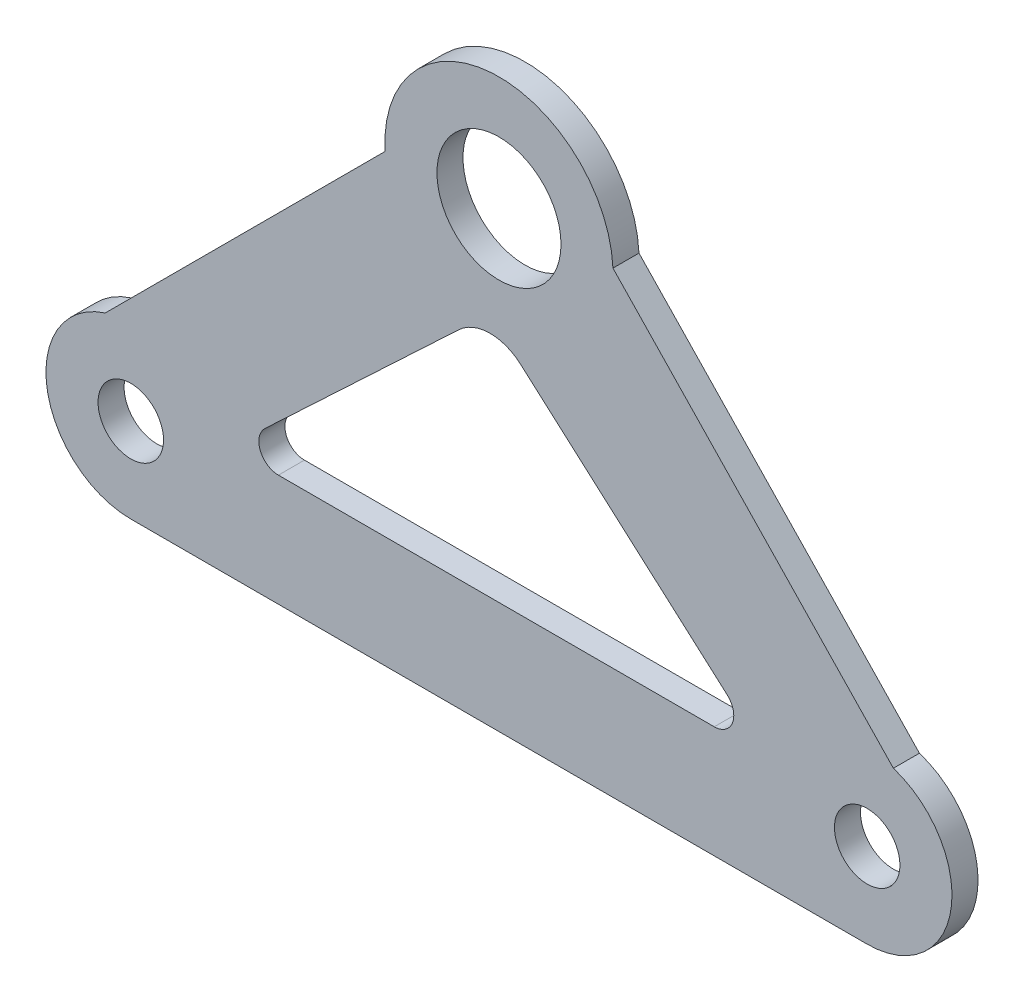
ISO-10303-21;
HEADER;
FILE_DESCRIPTION(('STEP AP214'),'2;1');
FILE_NAME('part.step','',(''),(''),'','','');
FILE_SCHEMA(('AUTOMOTIVE_DESIGN { 1 0 10303 214 1 1 1 1 }'));
ENDSEC;
DATA;
#1=APPLICATION_CONTEXT('core data for automotive mechanical design processes');
#2=APPLICATION_PROTOCOL_DEFINITION('international standard','automotive_design',2000,#1);
#3=PRODUCT_CONTEXT('',#1,'mechanical');
#4=PRODUCT('Part','Part','',(#3));
#5=PRODUCT_RELATED_PRODUCT_CATEGORY('part','',(#4));
#6=PRODUCT_DEFINITION_FORMATION('','',#4);
#7=PRODUCT_DEFINITION_CONTEXT('part definition',#1,'design');
#8=PRODUCT_DEFINITION('design','',#6,#7);
#9=PRODUCT_DEFINITION_SHAPE('','',#8);
#10=(LENGTH_UNIT() NAMED_UNIT(*) SI_UNIT(.MILLI.,.METRE.));
#11=(NAMED_UNIT(*) PLANE_ANGLE_UNIT() SI_UNIT($,.RADIAN.));
#12=(NAMED_UNIT(*) SI_UNIT($,.STERADIAN.) SOLID_ANGLE_UNIT());
#13=UNCERTAINTY_MEASURE_WITH_UNIT(LENGTH_MEASURE(1.E-05),#10,'distance_accuracy_value','');
#14=(GEOMETRIC_REPRESENTATION_CONTEXT(3) GLOBAL_UNCERTAINTY_ASSIGNED_CONTEXT((#13)) GLOBAL_UNIT_ASSIGNED_CONTEXT((#10,
#11,#12)) REPRESENTATION_CONTEXT('',''));
#15=CARTESIAN_POINT('',(0.,0.,0.));
#16=DIRECTION('',(0.,0.,1.));
#17=DIRECTION('',(1.,0.,0.));
#18=AXIS2_PLACEMENT_3D('',#15,#16,#17);
#19=CARTESIAN_POINT('',(-8.17185424949235,8.17185424949244,4.));
#20=DIRECTION('',(-0.707106781186544,0.707106781186551,0.));
#21=DIRECTION('',(-0.707106781186551,-0.707106781186544,0.));
#22=AXIS2_PLACEMENT_3D('',#19,#20,#21);
#23=PLANE('',#22);
#24=DIRECTION('',(0.707106781186551,0.707106781186544,0.));
#25=VECTOR('',#24,1.);
#26=CARTESIAN_POINT('',(-8.17185424949235,8.17185424949244,0.));
#27=LINE('',#26,#25);
#28=CARTESIAN_POINT('',(-60.4846655352054,-44.14095703622,0.));
#29=VERTEX_POINT('',#28);
#30=CARTESIAN_POINT('',(-17.4923289222252,-1.14862042324028,0.));
#31=VERTEX_POINT('',#30);
#32=EDGE_CURVE('E230',#29,#31,#27,.T.);
#33=ORIENTED_EDGE('',*,*,#32,.F.);
#34=DIRECTION('',(0.,0.,-1.));
#35=VECTOR('',#34,1.);
#36=CARTESIAN_POINT('',(-60.4846655352054,-44.14095703622,4.));
#37=LINE('',#36,#35);
#38=CARTESIAN_POINT('',(-60.4846655352054,-44.14095703622,4.));
#39=VERTEX_POINT('',#38);
#40=EDGE_CURVE('E270',#39,#29,#37,.T.);
#41=ORIENTED_EDGE('',*,*,#40,.F.);
#42=DIRECTION('',(0.707106781186551,0.707106781186544,0.));
#43=VECTOR('',#42,1.);
#44=CARTESIAN_POINT('',(-8.17185424949235,8.17185424949244,4.));
#45=LINE('',#44,#43);
#46=CARTESIAN_POINT('',(-17.4923289222252,-1.14862042324028,4.));
#47=VERTEX_POINT('',#46);
#48=EDGE_CURVE('E195',#39,#47,#45,.T.);
#49=ORIENTED_EDGE('',*,*,#48,.T.);
#50=DIRECTION('',(0.,0.,-1.));
#51=VECTOR('',#50,1.);
#52=CARTESIAN_POINT('',(-17.4923289222252,-1.14862042324028,4.));
#53=LINE('',#52,#51);
#54=EDGE_CURVE('E218',#47,#31,#53,.T.);
#55=ORIENTED_EDGE('',*,*,#54,.T.);
#56=EDGE_LOOP('',(#33,#41,#49,#55));
#57=FACE_BOUND('',#56,.T.);
#58=ADVANCED_FACE('F41',(#57),#23,.T.);
#59=CARTESIAN_POINT('',(-56.5685424949241,-56.5685424949235,4.));
#60=DIRECTION('',(0.,0.,-1.));
#61=DIRECTION('',(-1.,0.,0.));
#62=AXIS2_PLACEMENT_3D('',#59,#60,#61);
#63=CYLINDRICAL_SURFACE('',#62,13.03);
#64=CARTESIAN_POINT('',(-56.5685424949241,-56.5685424949235,0.));
#65=DIRECTION('',(0.,0.,1.));
#66=DIRECTION('',(1.,0.,0.));
#67=AXIS2_PLACEMENT_3D('',#64,#65,#66);
#68=CIRCLE('',#67,13.03);
#69=CARTESIAN_POINT('',(-56.5685424949241,-69.5985424949235,0.));
#70=VERTEX_POINT('',#69);
#71=EDGE_CURVE('E234',#29,#70,#68,.T.);
#72=ORIENTED_EDGE('',*,*,#71,.T.);
#73=DIRECTION('',(0.,0.,-1.));
#74=VECTOR('',#73,1.);
#75=CARTESIAN_POINT('',(-56.5685424949241,-69.5985424949235,4.));
#76=LINE('',#75,#74);
#77=CARTESIAN_POINT('',(-56.5685424949241,-69.5985424949235,4.));
#78=VERTEX_POINT('',#77);
#79=EDGE_CURVE('E266',#78,#70,#76,.T.);
#80=ORIENTED_EDGE('',*,*,#79,.F.);
#81=CARTESIAN_POINT('',(-56.5685424949241,-56.5685424949235,4.));
#82=DIRECTION('',(0.,0.,1.));
#83=DIRECTION('',(1.,0.,0.));
#84=AXIS2_PLACEMENT_3D('',#81,#82,#83);
#85=CIRCLE('',#84,13.03);
#86=EDGE_CURVE('E199',#39,#78,#85,.T.);
#87=ORIENTED_EDGE('',*,*,#86,.F.);
#88=ORIENTED_EDGE('',*,*,#40,.T.);
#89=EDGE_LOOP('',(#72,#80,#87,#88));
#90=FACE_BOUND('',#89,.T.);
#91=ADVANCED_FACE('F313',(#90),#63,.T.);
#92=CARTESIAN_POINT('',(0.,-69.5985424949235,4.));
#93=DIRECTION('',(0.,1.,0.));
#94=DIRECTION('',(0.,0.,1.));
#95=AXIS2_PLACEMENT_3D('',#92,#93,#94);
#96=PLANE('',#95);
#97=DIRECTION('',(1.,0.,0.));
#98=VECTOR('',#97,1.);
#99=CARTESIAN_POINT('',(0.,-69.5985424949235,0.));
#100=LINE('',#99,#98);
#101=CARTESIAN_POINT('',(56.5685424949241,-69.5985424949235,0.));
#102=VERTEX_POINT('',#101);
#103=EDGE_CURVE('E238',#70,#102,#100,.T.);
#104=ORIENTED_EDGE('',*,*,#103,.T.);
#105=DIRECTION('',(0.,0.,-1.));
#106=VECTOR('',#105,1.);
#107=CARTESIAN_POINT('',(56.5685424949241,-69.5985424949235,4.));
#108=LINE('',#107,#106);
#109=CARTESIAN_POINT('',(56.5685424949241,-69.5985424949235,4.));
#110=VERTEX_POINT('',#109);
#111=EDGE_CURVE('E262',#110,#102,#108,.T.);
#112=ORIENTED_EDGE('',*,*,#111,.F.);
#113=DIRECTION('',(1.,0.,0.));
#114=VECTOR('',#113,1.);
#115=CARTESIAN_POINT('',(0.,-69.5985424949235,4.));
#116=LINE('',#115,#114);
#117=EDGE_CURVE('E203',#78,#110,#116,.T.);
#118=ORIENTED_EDGE('',*,*,#117,.F.);
#119=ORIENTED_EDGE('',*,*,#79,.T.);
#120=EDGE_LOOP('',(#104,#112,#118,#119));
#121=FACE_BOUND('',#120,.T.);
#122=ADVANCED_FACE('F319',(#121),#96,.F.);
#123=CARTESIAN_POINT('',(56.5685424949241,-56.5685424949235,4.));
#124=DIRECTION('',(0.,0.,-1.));
#125=DIRECTION('',(-1.,0.,0.));
#126=AXIS2_PLACEMENT_3D('',#123,#124,#125);
#127=CYLINDRICAL_SURFACE('',#126,13.03);
#128=CARTESIAN_POINT('',(56.5685424949241,-56.5685424949235,0.));
#129=DIRECTION('',(0.,0.,1.));
#130=DIRECTION('',(1.,0.,0.));
#131=AXIS2_PLACEMENT_3D('',#128,#129,#130);
#132=CIRCLE('',#131,13.03);
#133=CARTESIAN_POINT('',(60.5951267420481,-44.1763062439149,0.));
#134=VERTEX_POINT('',#133);
#135=EDGE_CURVE('E242',#102,#134,#132,.T.);
#136=ORIENTED_EDGE('',*,*,#135,.T.);
#137=DIRECTION('',(0.,0.,-1.));
#138=VECTOR('',#137,1.);
#139=CARTESIAN_POINT('',(60.5951267420481,-44.1763062439149,4.));
#140=LINE('',#139,#138);
#141=CARTESIAN_POINT('',(60.5951267420481,-44.1763062439149,4.));
#142=VERTEX_POINT('',#141);
#143=EDGE_CURVE('E258',#142,#134,#140,.T.);
#144=ORIENTED_EDGE('',*,*,#143,.F.);
#145=CARTESIAN_POINT('',(56.5685424949241,-56.5685424949235,4.));
#146=DIRECTION('',(0.,0.,1.));
#147=DIRECTION('',(1.,0.,0.));
#148=AXIS2_PLACEMENT_3D('',#145,#146,#147);
#149=CIRCLE('',#148,13.03);
#150=EDGE_CURVE('E207',#110,#142,#149,.T.);
#151=ORIENTED_EDGE('',*,*,#150,.F.);
#152=ORIENTED_EDGE('',*,*,#111,.T.);
#153=EDGE_LOOP('',(#136,#144,#151,#152));
#154=FACE_BOUND('',#153,.T.);
#155=ADVANCED_FACE('F353',(#154),#127,.T.);
#156=CARTESIAN_POINT('',(9.54562944600616,9.13981659962306,4.));
#157=DIRECTION('',(-0.722293489893308,-0.691586664459159,0.));
#158=DIRECTION('',(0.691586664459159,-0.722293489893308,0.));
#159=AXIS2_PLACEMENT_3D('',#156,#157,#158);
#160=PLANE('',#159);
#161=DIRECTION('',(-0.691586664459159,0.722293489893308,0.));
#162=VECTOR('',#161,1.);
#163=CARTESIAN_POINT('',(9.54562944600616,9.13981659962306,0.));
#164=LINE('',#163,#162);
#165=CARTESIAN_POINT('',(17.5107628259957,0.821026949453272,0.));
#166=VERTEX_POINT('',#165);
#167=EDGE_CURVE('E246',#134,#166,#164,.T.);
#168=ORIENTED_EDGE('',*,*,#167,.T.);
#169=DIRECTION('',(0.,0.,-1.));
#170=VECTOR('',#169,1.);
#171=CARTESIAN_POINT('',(17.5107628259957,0.821026949453272,4.));
#172=LINE('',#171,#170);
#173=CARTESIAN_POINT('',(17.5107628259957,0.821026949453272,4.));
#174=VERTEX_POINT('',#173);
#175=EDGE_CURVE('E255',#174,#166,#172,.T.);
#176=ORIENTED_EDGE('',*,*,#175,.F.);
#177=DIRECTION('',(-0.691586664459159,0.722293489893308,0.));
#178=VECTOR('',#177,1.);
#179=CARTESIAN_POINT('',(9.54562944600616,9.13981659962306,4.));
#180=LINE('',#179,#178);
#181=EDGE_CURVE('E211',#142,#174,#180,.T.);
#182=ORIENTED_EDGE('',*,*,#181,.F.);
#183=ORIENTED_EDGE('',*,*,#143,.T.);
#184=EDGE_LOOP('',(#168,#176,#182,#183));
#185=FACE_BOUND('',#184,.T.);
#186=ADVANCED_FACE('F328',(#185),#160,.F.);
#187=CARTESIAN_POINT('',(-56.5685424949241,-56.5685424949235,4.));
#188=DIRECTION('',(0.,0.,-1.));
#189=DIRECTION('',(-1.,0.,0.));
#190=AXIS2_PLACEMENT_3D('',#187,#188,#189);
#191=CYLINDRICAL_SURFACE('',#190,5.03);
#192=CARTESIAN_POINT('',(-56.5685424949241,-56.5685424949235,4.));
#193=DIRECTION('',(0.,0.,1.));
#194=DIRECTION('',(1.,0.,0.));
#195=AXIS2_PLACEMENT_3D('',#192,#193,#194);
#196=CIRCLE('',#195,5.03);
#197=CARTESIAN_POINT('',(-51.5385424949241,-56.5685424949235,4.));
#198=VERTEX_POINT('',#197);
#199=EDGE_CURVE('E191',#198,#198,#196,.T.);
#200=ORIENTED_EDGE('',*,*,#199,.T.);
#201=EDGE_LOOP('',(#200));
#202=FACE_BOUND('',#201,.T.);
#203=CARTESIAN_POINT('',(-56.5685424949241,-56.5685424949235,0.));
#204=DIRECTION('',(0.,0.,1.));
#205=DIRECTION('',(1.,0.,0.));
#206=AXIS2_PLACEMENT_3D('',#203,#204,#205);
#207=CIRCLE('',#206,5.03);
#208=CARTESIAN_POINT('',(-51.5385424949241,-56.5685424949235,0.));
#209=VERTEX_POINT('',#208);
#210=EDGE_CURVE('E226',#209,#209,#207,.T.);
#211=ORIENTED_EDGE('',*,*,#210,.F.);
#212=EDGE_LOOP('',(#211));
#213=FACE_BOUND('',#212,.T.);
#214=ADVANCED_FACE('F325',(#202,#213),#191,.F.);
#215=CARTESIAN_POINT('',(56.5685424949241,-56.5685424949235,4.));
#216=DIRECTION('',(0.,0.,-1.));
#217=DIRECTION('',(-1.,0.,0.));
#218=AXIS2_PLACEMENT_3D('',#215,#216,#217);
#219=CYLINDRICAL_SURFACE('',#218,5.03);
#220=CARTESIAN_POINT('',(56.5685424949241,-56.5685424949235,4.));
#221=DIRECTION('',(0.,0.,1.));
#222=DIRECTION('',(1.,0.,0.));
#223=AXIS2_PLACEMENT_3D('',#220,#221,#222);
#224=CIRCLE('',#223,5.03);
#225=CARTESIAN_POINT('',(61.5985424949241,-56.5685424949235,4.));
#226=VERTEX_POINT('',#225);
#227=EDGE_CURVE('E186',#226,#226,#224,.T.);
#228=ORIENTED_EDGE('',*,*,#227,.T.);
#229=EDGE_LOOP('',(#228));
#230=FACE_BOUND('',#229,.T.);
#231=CARTESIAN_POINT('',(56.5685424949241,-56.5685424949235,0.));
#232=DIRECTION('',(0.,0.,1.));
#233=DIRECTION('',(1.,0.,0.));
#234=AXIS2_PLACEMENT_3D('',#231,#232,#233);
#235=CIRCLE('',#234,5.03);
#236=CARTESIAN_POINT('',(61.5985424949241,-56.5685424949235,0.));
#237=VERTEX_POINT('',#236);
#238=EDGE_CURVE('E222',#237,#237,#235,.T.);
#239=ORIENTED_EDGE('',*,*,#238,.F.);
#240=EDGE_LOOP('',(#239));
#241=FACE_BOUND('',#240,.T.);
#242=ADVANCED_FACE('F327',(#230,#241),#219,.F.);
#243=CARTESIAN_POINT('',(0.,0.,4.));
#244=DIRECTION('',(0.,0.,-1.));
#245=DIRECTION('',(-1.,0.,0.));
#246=AXIS2_PLACEMENT_3D('',#243,#244,#245);
#247=CYLINDRICAL_SURFACE('',#246,9.53);
#248=CARTESIAN_POINT('',(0.,0.,4.));
#249=DIRECTION('',(0.,0.,1.));
#250=DIRECTION('',(1.,0.,0.));
#251=AXIS2_PLACEMENT_3D('',#248,#249,#250);
#252=CIRCLE('',#251,9.53);
#253=CARTESIAN_POINT('',(9.53,0.,4.));
#254=VERTEX_POINT('',#253);
#255=EDGE_CURVE('E182',#254,#254,#252,.T.);
#256=ORIENTED_EDGE('',*,*,#255,.T.);
#257=EDGE_LOOP('',(#256));
#258=FACE_BOUND('',#257,.T.);
#259=CARTESIAN_POINT('',(0.,0.,0.));
#260=DIRECTION('',(0.,0.,1.));
#261=DIRECTION('',(1.,0.,0.));
#262=AXIS2_PLACEMENT_3D('',#259,#260,#261);
#263=CIRCLE('',#262,9.53);
#264=CARTESIAN_POINT('',(9.53,0.,0.));
#265=VERTEX_POINT('',#264);
#266=EDGE_CURVE('E171',#265,#265,#263,.T.);
#267=ORIENTED_EDGE('',*,*,#266,.F.);
#268=EDGE_LOOP('',(#267));
#269=FACE_BOUND('',#268,.T.);
#270=ADVANCED_FACE('F43',(#258,#269),#247,.F.);
#271=CARTESIAN_POINT('',(0.,0.,4.));
#272=DIRECTION('',(0.,0.,-1.));
#273=DIRECTION('',(-1.,0.,0.));
#274=AXIS2_PLACEMENT_3D('',#271,#272,#273);
#275=CYLINDRICAL_SURFACE('',#274,17.53);
#276=CARTESIAN_POINT('',(0.,0.,0.));
#277=DIRECTION('',(0.,0.,1.));
#278=DIRECTION('',(1.,0.,0.));
#279=AXIS2_PLACEMENT_3D('',#276,#277,#278);
#280=CIRCLE('',#279,17.53);
#281=EDGE_CURVE('E187',#31,#166,#280,.F.);
#282=ORIENTED_EDGE('',*,*,#281,.F.);
#283=ORIENTED_EDGE('',*,*,#54,.F.);
#284=CARTESIAN_POINT('',(0.,0.,4.));
#285=DIRECTION('',(0.,0.,1.));
#286=DIRECTION('',(1.,0.,0.));
#287=AXIS2_PLACEMENT_3D('',#284,#285,#286);
#288=CIRCLE('',#287,17.53);
#289=EDGE_CURVE('E214',#47,#174,#288,.F.);
#290=ORIENTED_EDGE('',*,*,#289,.T.);
#291=ORIENTED_EDGE('',*,*,#175,.T.);
#292=EDGE_LOOP('',(#282,#283,#290,#291));
#293=FACE_BOUND('',#292,.T.);
#294=ADVANCED_FACE('F335',(#293),#275,.T.);
#295=CARTESIAN_POINT('',(0.,0.,4.));
#296=DIRECTION('',(0.,0.,1.));
#297=DIRECTION('',(1.,0.,0.));
#298=AXIS2_PLACEMENT_3D('',#295,#296,#297);
#299=PLANE('',#298);
#300=CARTESIAN_POINT('',(33.0731108120694,-49.4212640169466,4.));
#301=DIRECTION('',(0.,0.,1.));
#302=DIRECTION('',(-1.,0.,0.));
#303=AXIS2_PLACEMENT_3D('',#300,#301,#302);
#304=CIRCLE('',#303,3.);
#305=CARTESIAN_POINT('',(33.0731108120694,-52.4212640169466,4.));
#306=VERTEX_POINT('',#305);
#307=CARTESIAN_POINT('',(35.0616638028854,-47.1750100235797,4.));
#308=VERTEX_POINT('',#307);
#309=EDGE_CURVE('E57',#306,#308,#304,.T.);
#310=ORIENTED_EDGE('',*,*,#309,.F.);
#311=DIRECTION('',(1.,0.,0.));
#312=VECTOR('',#311,1.);
#313=CARTESIAN_POINT('',(33.0731108120694,-52.4212640169466,4.));
#314=LINE('',#313,#312);
#315=CARTESIAN_POINT('',(-33.8886305190566,-52.4212640169466,4.));
#316=VERTEX_POINT('',#315);
#317=EDGE_CURVE('E164',#316,#306,#314,.T.);
#318=ORIENTED_EDGE('',*,*,#317,.F.);
#319=CARTESIAN_POINT('',(-33.8886305190566,-49.4212640169466,4.));
#320=DIRECTION('',(0.,0.,1.));
#321=DIRECTION('',(-1.,0.,0.));
#322=AXIS2_PLACEMENT_3D('',#319,#320,#321);
#323=CIRCLE('',#322,3.);
#324=CARTESIAN_POINT('',(-35.9446373969796,-47.2365819535943,4.));
#325=VERTEX_POINT('',#324);
#326=EDGE_CURVE('E157',#325,#316,#323,.T.);
#327=ORIENTED_EDGE('',*,*,#326,.F.);
#328=DIRECTION('',(-0.728227354450776,-0.685335625974328,0.));
#329=VECTOR('',#328,1.);
#330=CARTESIAN_POINT('',(-35.9446373969796,-47.2365819535943,4.));
#331=LINE('',#330,#329);
#332=CARTESIAN_POINT('',(-6.14606504222908,-19.1931102094075,4.));
#333=VERTEX_POINT('',#332);
#334=EDGE_CURVE('E153',#333,#325,#331,.T.);
#335=ORIENTED_EDGE('',*,*,#334,.F.);
#336=CARTESIAN_POINT('',(-1.34871566040878,-24.2907016905629,4.));
#337=DIRECTION('',(0.,0.,1.));
#338=DIRECTION('',(1.,0.,0.));
#339=AXIS2_PLACEMENT_3D('',#336,#337,#338);
#340=CIRCLE('',#339,7.);
#341=CARTESIAN_POINT('',(3.29124131816185,-19.0494423727068,4.));
#342=VERTEX_POINT('',#341);
#343=EDGE_CURVE('E134',#342,#333,#340,.T.);
#344=ORIENTED_EDGE('',*,*,#343,.F.);
#345=DIRECTION('',(-0.748751331122304,0.662850996938662,0.));
#346=VECTOR('',#345,1.);
#347=CARTESIAN_POINT('',(3.29124131816185,-19.0494423727068,4.));
#348=LINE('',#347,#346);
#349=EDGE_CURVE('E144',#308,#342,#348,.T.);
#350=ORIENTED_EDGE('',*,*,#349,.F.);
#351=EDGE_LOOP('',(#310,#318,#327,#335,#344,#350));
#352=FACE_BOUND('',#351,.T.);
#353=ORIENTED_EDGE('',*,*,#255,.F.);
#354=EDGE_LOOP('',(#353));
#355=FACE_BOUND('',#354,.T.);
#356=ORIENTED_EDGE('',*,*,#227,.F.);
#357=EDGE_LOOP('',(#356));
#358=FACE_BOUND('',#357,.T.);
#359=ORIENTED_EDGE('',*,*,#199,.F.);
#360=EDGE_LOOP('',(#359));
#361=FACE_BOUND('',#360,.T.);
#362=ORIENTED_EDGE('',*,*,#48,.F.);
#363=ORIENTED_EDGE('',*,*,#86,.T.);
#364=ORIENTED_EDGE('',*,*,#117,.T.);
#365=ORIENTED_EDGE('',*,*,#150,.T.);
#366=ORIENTED_EDGE('',*,*,#181,.T.);
#367=ORIENTED_EDGE('',*,*,#289,.F.);
#368=EDGE_LOOP('',(#362,#363,#364,#365,#366,#367));
#369=FACE_BOUND('',#368,.T.);
#370=ADVANCED_FACE('F149',(#352,#355,#358,#361,#369),#299,.T.);
#371=CARTESIAN_POINT('',(0.,0.,0.));
#372=DIRECTION('',(0.,0.,1.));
#373=DIRECTION('',(1.,0.,0.));
#374=AXIS2_PLACEMENT_3D('',#371,#372,#373);
#375=PLANE('',#374);
#376=DIRECTION('',(1.,0.,0.));
#377=VECTOR('',#376,1.);
#378=CARTESIAN_POINT('',(0.,-52.4212640169466,0.));
#379=LINE('',#378,#377);
#380=CARTESIAN_POINT('',(-33.8886305190566,-52.4212640169466,0.));
#381=VERTEX_POINT('',#380);
#382=CARTESIAN_POINT('',(33.0731108120694,-52.4212640169466,0.));
#383=VERTEX_POINT('',#382);
#384=EDGE_CURVE('E50',#381,#383,#379,.T.);
#385=ORIENTED_EDGE('',*,*,#384,.T.);
#386=CARTESIAN_POINT('',(33.0731108120694,-49.4212640169466,0.));
#387=DIRECTION('',(0.,0.,1.));
#388=DIRECTION('',(1.,0.,0.));
#389=AXIS2_PLACEMENT_3D('',#386,#387,#388);
#390=CIRCLE('',#389,3.);
#391=CARTESIAN_POINT('',(35.0616638028854,-47.1750100235797,0.));
#392=VERTEX_POINT('',#391);
#393=EDGE_CURVE('E11',#383,#392,#390,.T.);
#394=ORIENTED_EDGE('',*,*,#393,.T.);
#395=DIRECTION('',(-0.748751331122304,0.662850996938662,0.));
#396=VECTOR('',#395,1.);
#397=CARTESIAN_POINT('',(-8.00836208059232,-9.04618352487407,0.));
#398=LINE('',#397,#396);
#399=CARTESIAN_POINT('',(3.29124131816185,-19.0494423727068,0.));
#400=VERTEX_POINT('',#399);
#401=EDGE_CURVE('E273',#392,#400,#398,.T.);
#402=ORIENTED_EDGE('',*,*,#401,.T.);
#403=CARTESIAN_POINT('',(-1.34871566040878,-24.2907016905629,0.));
#404=DIRECTION('',(0.,0.,1.));
#405=DIRECTION('',(1.,0.,0.));
#406=AXIS2_PLACEMENT_3D('',#403,#404,#405);
#407=CIRCLE('',#406,7.);
#408=CARTESIAN_POINT('',(-6.14606504222908,-19.1931102094075,0.));
#409=VERTEX_POINT('',#408);
#410=EDGE_CURVE('E137',#400,#409,#407,.T.);
#411=ORIENTED_EDGE('',*,*,#410,.T.);
#412=DIRECTION('',(-0.728227354450776,-0.685335625974328,0.));
#413=VECTOR('',#412,1.);
#414=CARTESIAN_POINT('',(6.69218624962515,-7.11101670970033,0.));
#415=LINE('',#414,#413);
#416=CARTESIAN_POINT('',(-35.9446373969796,-47.2365819535943,0.));
#417=VERTEX_POINT('',#416);
#418=EDGE_CURVE('E278',#409,#417,#415,.T.);
#419=ORIENTED_EDGE('',*,*,#418,.T.);
#420=CARTESIAN_POINT('',(-33.8886305190566,-49.4212640169466,0.));
#421=DIRECTION('',(0.,0.,1.));
#422=DIRECTION('',(1.,0.,0.));
#423=AXIS2_PLACEMENT_3D('',#420,#421,#422);
#424=CIRCLE('',#423,3.);
#425=EDGE_CURVE('E282',#417,#381,#424,.T.);
#426=ORIENTED_EDGE('',*,*,#425,.T.);
#427=EDGE_LOOP('',(#385,#394,#402,#411,#419,#426));
#428=FACE_BOUND('',#427,.T.);
#429=ORIENTED_EDGE('',*,*,#266,.T.);
#430=EDGE_LOOP('',(#429));
#431=FACE_BOUND('',#430,.T.);
#432=ORIENTED_EDGE('',*,*,#238,.T.);
#433=EDGE_LOOP('',(#432));
#434=FACE_BOUND('',#433,.T.);
#435=ORIENTED_EDGE('',*,*,#210,.T.);
#436=EDGE_LOOP('',(#435));
#437=FACE_BOUND('',#436,.T.);
#438=ORIENTED_EDGE('',*,*,#32,.T.);
#439=ORIENTED_EDGE('',*,*,#281,.T.);
#440=ORIENTED_EDGE('',*,*,#167,.F.);
#441=ORIENTED_EDGE('',*,*,#135,.F.);
#442=ORIENTED_EDGE('',*,*,#103,.F.);
#443=ORIENTED_EDGE('',*,*,#71,.F.);
#444=EDGE_LOOP('',(#438,#439,#440,#441,#442,#443));
#445=FACE_BOUND('',#444,.T.);
#446=ADVANCED_FACE('F288',(#428,#431,#434,#437,#445),#375,.F.);
#447=CARTESIAN_POINT('',(33.0731108120694,-49.4212640169466,-6.));
#448=DIRECTION('',(0.,0.,1.));
#449=DIRECTION('',(1.,0.,0.));
#450=AXIS2_PLACEMENT_3D('',#447,#448,#449);
#451=CYLINDRICAL_SURFACE('',#450,3.);
#452=DIRECTION('',(0.,0.,1.));
#453=VECTOR('',#452,1.);
#454=CARTESIAN_POINT('',(33.0731108120694,-52.4212640169466,-6.));
#455=LINE('',#454,#453);
#456=EDGE_CURVE('E168',#383,#306,#455,.T.);
#457=ORIENTED_EDGE('',*,*,#456,.T.);
#458=ORIENTED_EDGE('',*,*,#309,.T.);
#459=DIRECTION('',(0.,0.,1.));
#460=VECTOR('',#459,1.);
#461=CARTESIAN_POINT('',(35.0616638028854,-47.1750100235797,-6.));
#462=LINE('',#461,#460);
#463=EDGE_CURVE('E141',#392,#308,#462,.T.);
#464=ORIENTED_EDGE('',*,*,#463,.F.);
#465=ORIENTED_EDGE('',*,*,#393,.F.);
#466=EDGE_LOOP('',(#457,#458,#464,#465));
#467=FACE_BOUND('',#466,.T.);
#468=ADVANCED_FACE('F301',(#467),#451,.F.);
#469=CARTESIAN_POINT('',(33.0731108120694,-52.4212640169466,-6.));
#470=DIRECTION('',(0.,-1.,0.));
#471=DIRECTION('',(1.,0.,0.));
#472=AXIS2_PLACEMENT_3D('',#469,#470,#471);
#473=PLANE('',#472);
#474=DIRECTION('',(0.,0.,1.));
#475=VECTOR('',#474,1.);
#476=CARTESIAN_POINT('',(-33.8886305190566,-52.4212640169466,-6.));
#477=LINE('',#476,#475);
#478=EDGE_CURVE('E172',#381,#316,#477,.T.);
#479=ORIENTED_EDGE('',*,*,#478,.T.);
#480=ORIENTED_EDGE('',*,*,#317,.T.);
#481=ORIENTED_EDGE('',*,*,#456,.F.);
#482=ORIENTED_EDGE('',*,*,#384,.F.);
#483=EDGE_LOOP('',(#479,#480,#481,#482));
#484=FACE_BOUND('',#483,.T.);
#485=ADVANCED_FACE('F293',(#484),#473,.F.);
#486=CARTESIAN_POINT('',(-33.8886305190566,-49.4212640169466,-6.));
#487=DIRECTION('',(0.,0.,1.));
#488=DIRECTION('',(1.,0.,0.));
#489=AXIS2_PLACEMENT_3D('',#486,#487,#488);
#490=CYLINDRICAL_SURFACE('',#489,3.);
#491=DIRECTION('',(0.,0.,1.));
#492=VECTOR('',#491,1.);
#493=CARTESIAN_POINT('',(-35.9446373969796,-47.2365819535943,-6.));
#494=LINE('',#493,#492);
#495=EDGE_CURVE('E175',#417,#325,#494,.T.);
#496=ORIENTED_EDGE('',*,*,#495,.T.);
#497=ORIENTED_EDGE('',*,*,#326,.T.);
#498=ORIENTED_EDGE('',*,*,#478,.F.);
#499=ORIENTED_EDGE('',*,*,#425,.F.);
#500=EDGE_LOOP('',(#496,#497,#498,#499));
#501=FACE_BOUND('',#500,.T.);
#502=ADVANCED_FACE('F295',(#501),#490,.F.);
#503=CARTESIAN_POINT('',(-35.9446373969796,-47.2365819535943,-6.));
#504=DIRECTION('',(-0.685335625974328,0.728227354450776,0.));
#505=DIRECTION('',(-0.728227354450776,-0.685335625974328,0.));
#506=AXIS2_PLACEMENT_3D('',#503,#504,#505);
#507=PLANE('',#506);
#508=DIRECTION('',(0.,0.,1.));
#509=VECTOR('',#508,1.);
#510=CARTESIAN_POINT('',(-6.14606504222908,-19.1931102094075,-6.));
#511=LINE('',#510,#509);
#512=EDGE_CURVE('E140',#409,#333,#511,.T.);
#513=ORIENTED_EDGE('',*,*,#512,.T.);
#514=ORIENTED_EDGE('',*,*,#334,.T.);
#515=ORIENTED_EDGE('',*,*,#495,.F.);
#516=ORIENTED_EDGE('',*,*,#418,.F.);
#517=EDGE_LOOP('',(#513,#514,#515,#516));
#518=FACE_BOUND('',#517,.T.);
#519=ADVANCED_FACE('F300',(#518),#507,.F.);
#520=CARTESIAN_POINT('',(-1.34871566040878,-24.2907016905629,-6.));
#521=DIRECTION('',(0.,0.,1.));
#522=DIRECTION('',(1.,0.,0.));
#523=AXIS2_PLACEMENT_3D('',#520,#521,#522);
#524=CYLINDRICAL_SURFACE('',#523,7.);
#525=DIRECTION('',(0.,0.,1.));
#526=VECTOR('',#525,1.);
#527=CARTESIAN_POINT('',(3.29124131816185,-19.0494423727068,-6.));
#528=LINE('',#527,#526);
#529=EDGE_CURVE('E65',#400,#342,#528,.T.);
#530=ORIENTED_EDGE('',*,*,#529,.T.);
#531=ORIENTED_EDGE('',*,*,#343,.T.);
#532=ORIENTED_EDGE('',*,*,#512,.F.);
#533=ORIENTED_EDGE('',*,*,#410,.F.);
#534=EDGE_LOOP('',(#530,#531,#532,#533));
#535=FACE_BOUND('',#534,.T.);
#536=ADVANCED_FACE('F131',(#535),#524,.F.);
#537=CARTESIAN_POINT('',(3.29124131816185,-19.0494423727068,-6.));
#538=DIRECTION('',(0.662850996938662,0.748751331122304,0.));
#539=DIRECTION('',(-0.748751331122304,0.662850996938662,0.));
#540=AXIS2_PLACEMENT_3D('',#537,#538,#539);
#541=PLANE('',#540);
#542=ORIENTED_EDGE('',*,*,#463,.T.);
#543=ORIENTED_EDGE('',*,*,#349,.T.);
#544=ORIENTED_EDGE('',*,*,#529,.F.);
#545=ORIENTED_EDGE('',*,*,#401,.F.);
#546=EDGE_LOOP('',(#542,#543,#544,#545));
#547=FACE_BOUND('',#546,.T.);
#548=ADVANCED_FACE('F145',(#547),#541,.F.);
#549=CLOSED_SHELL('',(#58,#91,#122,#155,#186,#214,#242,#270,#294,#370,#446,#468,#485,#502,#519,
#536,#548));
#550=MANIFOLD_SOLID_BREP('B2',#549);
#551=ADVANCED_BREP_SHAPE_REPRESENTATION('',(#18,#550),#14);
#552=SHAPE_DEFINITION_REPRESENTATION(#9,#551);
ENDSEC;
END-ISO-10303-21;
